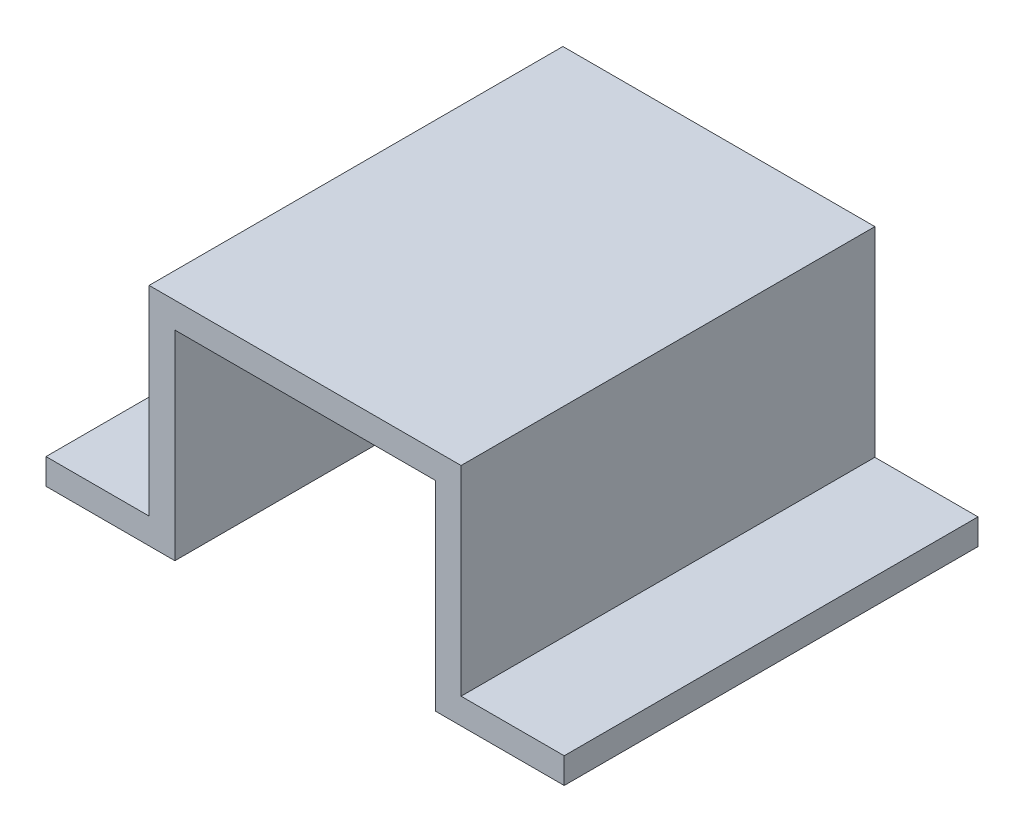
ISO-10303-21;
HEADER;
FILE_DESCRIPTION(('STEP AP214'),'2;1');
FILE_NAME('part.step','',(''),(''),'','','');
FILE_SCHEMA(('AUTOMOTIVE_DESIGN { 1 0 10303 214 1 1 1 1 }'));
ENDSEC;
DATA;
#1=APPLICATION_CONTEXT('core data for automotive mechanical design processes');
#2=APPLICATION_PROTOCOL_DEFINITION('international standard','automotive_design',2000,#1);
#3=PRODUCT_CONTEXT('',#1,'mechanical');
#4=PRODUCT('Part','Part','',(#3));
#5=PRODUCT_RELATED_PRODUCT_CATEGORY('part','',(#4));
#6=PRODUCT_DEFINITION_FORMATION('','',#4);
#7=PRODUCT_DEFINITION_CONTEXT('part definition',#1,'design');
#8=PRODUCT_DEFINITION('design','',#6,#7);
#9=PRODUCT_DEFINITION_SHAPE('','',#8);
#10=(LENGTH_UNIT() NAMED_UNIT(*) SI_UNIT(.MILLI.,.METRE.));
#11=(NAMED_UNIT(*) PLANE_ANGLE_UNIT() SI_UNIT($,.RADIAN.));
#12=(NAMED_UNIT(*) SI_UNIT($,.STERADIAN.) SOLID_ANGLE_UNIT());
#13=UNCERTAINTY_MEASURE_WITH_UNIT(LENGTH_MEASURE(1.E-05),#10,'distance_accuracy_value','');
#14=(GEOMETRIC_REPRESENTATION_CONTEXT(3) GLOBAL_UNCERTAINTY_ASSIGNED_CONTEXT((#13)) GLOBAL_UNIT_ASSIGNED_CONTEXT((#10,
#11,#12)) REPRESENTATION_CONTEXT('',''));
#15=CARTESIAN_POINT('',(0.,0.,0.));
#16=DIRECTION('',(0.,0.,1.));
#17=DIRECTION('',(1.,0.,0.));
#18=AXIS2_PLACEMENT_3D('',#15,#16,#17);
#19=CARTESIAN_POINT('',(26.1770114942529,-16.6609195402299,-32.1));
#20=DIRECTION('',(1.,0.,0.));
#21=DIRECTION('',(0.,0.,-1.));
#22=AXIS2_PLACEMENT_3D('',#19,#20,#21);
#23=PLANE('',#22);
#24=DIRECTION('',(0.,1.,0.));
#25=VECTOR('',#24,1.);
#26=CARTESIAN_POINT('',(26.1770114942529,-16.6609195402299,0.));
#27=LINE('',#26,#25);
#28=CARTESIAN_POINT('',(26.1770114942529,-18.6609195402299,0.));
#29=VERTEX_POINT('',#28);
#30=CARTESIAN_POINT('',(26.1770114942529,-16.6609195402299,0.));
#31=VERTEX_POINT('',#30);
#32=EDGE_CURVE('E158',#29,#31,#27,.T.);
#33=ORIENTED_EDGE('',*,*,#32,.F.);
#34=DIRECTION('',(0.,0.,1.));
#35=VECTOR('',#34,1.);
#36=CARTESIAN_POINT('',(26.1770114942529,-18.6609195402299,-32.1));
#37=LINE('',#36,#35);
#38=CARTESIAN_POINT('',(26.1770114942529,-18.6609195402299,-32.1));
#39=VERTEX_POINT('',#38);
#40=EDGE_CURVE('E11',#39,#29,#37,.T.);
#41=ORIENTED_EDGE('',*,*,#40,.F.);
#42=DIRECTION('',(0.,1.,0.));
#43=VECTOR('',#42,1.);
#44=CARTESIAN_POINT('',(26.1770114942529,-16.6609195402299,-32.1));
#45=LINE('',#44,#43);
#46=CARTESIAN_POINT('',(26.1770114942529,-16.6609195402299,-32.1));
#47=VERTEX_POINT('',#46);
#48=EDGE_CURVE('E190',#39,#47,#45,.T.);
#49=ORIENTED_EDGE('',*,*,#48,.T.);
#50=DIRECTION('',(0.,0.,1.));
#51=VECTOR('',#50,1.);
#52=CARTESIAN_POINT('',(26.1770114942529,-16.6609195402299,-32.1));
#53=LINE('',#52,#51);
#54=EDGE_CURVE('E40',#47,#31,#53,.T.);
#55=ORIENTED_EDGE('',*,*,#54,.T.);
#56=EDGE_LOOP('',(#33,#41,#49,#55));
#57=FACE_BOUND('',#56,.T.);
#58=ADVANCED_FACE('F37',(#57),#23,.T.);
#59=CARTESIAN_POINT('',(26.1770114942529,-18.6609195402299,-32.1));
#60=DIRECTION('',(0.,-1.,0.));
#61=DIRECTION('',(0.,0.,-1.));
#62=AXIS2_PLACEMENT_3D('',#59,#60,#61);
#63=PLANE('',#62);
#64=DIRECTION('',(1.,0.,0.));
#65=VECTOR('',#64,1.);
#66=CARTESIAN_POINT('',(26.1770114942529,-18.6609195402299,0.));
#67=LINE('',#66,#65);
#68=CARTESIAN_POINT('',(16.1770114942529,-18.6609195402299,0.));
#69=VERTEX_POINT('',#68);
#70=EDGE_CURVE('E188',#69,#29,#67,.T.);
#71=ORIENTED_EDGE('',*,*,#70,.F.);
#72=DIRECTION('',(0.,0.,1.));
#73=VECTOR('',#72,1.);
#74=CARTESIAN_POINT('',(16.1770114942529,-18.6609195402299,-32.1));
#75=LINE('',#74,#73);
#76=CARTESIAN_POINT('',(16.1770114942529,-18.6609195402299,-32.1));
#77=VERTEX_POINT('',#76);
#78=EDGE_CURVE('E46',#77,#69,#75,.T.);
#79=ORIENTED_EDGE('',*,*,#78,.F.);
#80=DIRECTION('',(1.,0.,0.));
#81=VECTOR('',#80,1.);
#82=CARTESIAN_POINT('',(26.1770114942529,-18.6609195402299,-32.1));
#83=LINE('',#82,#81);
#84=EDGE_CURVE('E148',#77,#39,#83,.T.);
#85=ORIENTED_EDGE('',*,*,#84,.T.);
#86=ORIENTED_EDGE('',*,*,#40,.T.);
#87=EDGE_LOOP('',(#71,#79,#85,#86));
#88=FACE_BOUND('',#87,.T.);
#89=ADVANCED_FACE('F210',(#88),#63,.T.);
#90=CARTESIAN_POINT('',(16.1770114942529,-18.6609195402299,-32.1));
#91=DIRECTION('',(-1.,0.,0.));
#92=DIRECTION('',(0.,0.,1.));
#93=AXIS2_PLACEMENT_3D('',#90,#91,#92);
#94=PLANE('',#93);
#95=DIRECTION('',(0.,-1.,0.));
#96=VECTOR('',#95,1.);
#97=CARTESIAN_POINT('',(16.1770114942529,-18.6609195402299,0.));
#98=LINE('',#97,#96);
#99=CARTESIAN_POINT('',(16.1770114942529,-3.16091954022988,0.));
#100=VERTEX_POINT('',#99);
#101=EDGE_CURVE('E135',#100,#69,#98,.T.);
#102=ORIENTED_EDGE('',*,*,#101,.F.);
#103=DIRECTION('',(0.,0.,1.));
#104=VECTOR('',#103,1.);
#105=CARTESIAN_POINT('',(16.1770114942529,-3.16091954022988,-32.1));
#106=LINE('',#105,#104);
#107=CARTESIAN_POINT('',(16.1770114942529,-3.16091954022988,-32.1));
#108=VERTEX_POINT('',#107);
#109=EDGE_CURVE('E130',#108,#100,#106,.T.);
#110=ORIENTED_EDGE('',*,*,#109,.F.);
#111=DIRECTION('',(0.,-1.,0.));
#112=VECTOR('',#111,1.);
#113=CARTESIAN_POINT('',(16.1770114942529,-18.6609195402299,-32.1));
#114=LINE('',#113,#112);
#115=EDGE_CURVE('E133',#108,#77,#114,.T.);
#116=ORIENTED_EDGE('',*,*,#115,.T.);
#117=ORIENTED_EDGE('',*,*,#78,.T.);
#118=EDGE_LOOP('',(#102,#110,#116,#117));
#119=FACE_BOUND('',#118,.T.);
#120=ADVANCED_FACE('F132',(#119),#94,.T.);
#121=CARTESIAN_POINT('',(16.1770114942529,-3.16091954022988,-32.1));
#122=DIRECTION('',(0.,-1.,0.));
#123=DIRECTION('',(1.,0.,0.));
#124=AXIS2_PLACEMENT_3D('',#121,#122,#123);
#125=PLANE('',#124);
#126=DIRECTION('',(1.,0.,0.));
#127=VECTOR('',#126,1.);
#128=CARTESIAN_POINT('',(16.1770114942529,-3.16091954022988,0.));
#129=LINE('',#128,#127);
#130=CARTESIAN_POINT('',(-4.02298850574712,-3.16091954022988,0.));
#131=VERTEX_POINT('',#130);
#132=EDGE_CURVE('E185',#131,#100,#129,.T.);
#133=ORIENTED_EDGE('',*,*,#132,.F.);
#134=DIRECTION('',(0.,0.,1.));
#135=VECTOR('',#134,1.);
#136=CARTESIAN_POINT('',(-4.02298850574712,-3.16091954022988,-32.1));
#137=LINE('',#136,#135);
#138=CARTESIAN_POINT('',(-4.02298850574712,-3.16091954022988,-32.1));
#139=VERTEX_POINT('',#138);
#140=EDGE_CURVE('E140',#139,#131,#137,.T.);
#141=ORIENTED_EDGE('',*,*,#140,.F.);
#142=DIRECTION('',(1.,0.,0.));
#143=VECTOR('',#142,1.);
#144=CARTESIAN_POINT('',(16.1770114942529,-3.16091954022988,-32.1));
#145=LINE('',#144,#143);
#146=EDGE_CURVE('E146',#139,#108,#145,.T.);
#147=ORIENTED_EDGE('',*,*,#146,.T.);
#148=ORIENTED_EDGE('',*,*,#109,.T.);
#149=EDGE_LOOP('',(#133,#141,#147,#148));
#150=FACE_BOUND('',#149,.T.);
#151=ADVANCED_FACE('F150',(#150),#125,.T.);
#152=CARTESIAN_POINT('',(-4.02298850574712,-3.16091954022988,-32.1));
#153=DIRECTION('',(1.,0.,0.));
#154=DIRECTION('',(0.,1.,0.));
#155=AXIS2_PLACEMENT_3D('',#152,#153,#154);
#156=PLANE('',#155);
#157=DIRECTION('',(0.,1.,0.));
#158=VECTOR('',#157,1.);
#159=CARTESIAN_POINT('',(-4.02298850574712,-3.16091954022988,0.));
#160=LINE('',#159,#158);
#161=CARTESIAN_POINT('',(-4.02298850574712,-18.6609195402299,0.));
#162=VERTEX_POINT('',#161);
#163=EDGE_CURVE('E182',#162,#131,#160,.T.);
#164=ORIENTED_EDGE('',*,*,#163,.F.);
#165=DIRECTION('',(0.,0.,1.));
#166=VECTOR('',#165,1.);
#167=CARTESIAN_POINT('',(-4.02298850574712,-18.6609195402299,-32.1));
#168=LINE('',#167,#166);
#169=CARTESIAN_POINT('',(-4.02298850574712,-18.6609195402299,-32.1));
#170=VERTEX_POINT('',#169);
#171=EDGE_CURVE('E194',#170,#162,#168,.T.);
#172=ORIENTED_EDGE('',*,*,#171,.F.);
#173=DIRECTION('',(0.,1.,0.));
#174=VECTOR('',#173,1.);
#175=CARTESIAN_POINT('',(-4.02298850574712,-3.16091954022988,-32.1));
#176=LINE('',#175,#174);
#177=EDGE_CURVE('E151',#170,#139,#176,.T.);
#178=ORIENTED_EDGE('',*,*,#177,.T.);
#179=ORIENTED_EDGE('',*,*,#140,.T.);
#180=EDGE_LOOP('',(#164,#172,#178,#179));
#181=FACE_BOUND('',#180,.T.);
#182=ADVANCED_FACE('F223',(#181),#156,.T.);
#183=CARTESIAN_POINT('',(-4.02298850574712,-18.6609195402299,-32.1));
#184=DIRECTION('',(0.,-1.,0.));
#185=DIRECTION('',(1.,0.,0.));
#186=AXIS2_PLACEMENT_3D('',#183,#184,#185);
#187=PLANE('',#186);
#188=DIRECTION('',(1.,0.,0.));
#189=VECTOR('',#188,1.);
#190=CARTESIAN_POINT('',(-4.02298850574712,-18.6609195402299,0.));
#191=LINE('',#190,#189);
#192=CARTESIAN_POINT('',(-14.0229885057471,-18.6609195402299,0.));
#193=VERTEX_POINT('',#192);
#194=EDGE_CURVE('E179',#193,#162,#191,.T.);
#195=ORIENTED_EDGE('',*,*,#194,.F.);
#196=DIRECTION('',(0.,0.,1.));
#197=VECTOR('',#196,1.);
#198=CARTESIAN_POINT('',(-14.0229885057471,-18.6609195402299,-32.1));
#199=LINE('',#198,#197);
#200=CARTESIAN_POINT('',(-14.0229885057471,-18.6609195402299,-32.1));
#201=VERTEX_POINT('',#200);
#202=EDGE_CURVE('E196',#201,#193,#199,.T.);
#203=ORIENTED_EDGE('',*,*,#202,.F.);
#204=DIRECTION('',(1.,0.,0.));
#205=VECTOR('',#204,1.);
#206=CARTESIAN_POINT('',(-4.02298850574712,-18.6609195402299,-32.1));
#207=LINE('',#206,#205);
#208=EDGE_CURVE('E153',#201,#170,#207,.T.);
#209=ORIENTED_EDGE('',*,*,#208,.T.);
#210=ORIENTED_EDGE('',*,*,#171,.T.);
#211=EDGE_LOOP('',(#195,#203,#209,#210));
#212=FACE_BOUND('',#211,.T.);
#213=ADVANCED_FACE('F226',(#212),#187,.T.);
#214=CARTESIAN_POINT('',(-14.0229885057471,-18.6609195402299,-32.1));
#215=DIRECTION('',(-1.,0.,0.));
#216=DIRECTION('',(0.,0.,1.));
#217=AXIS2_PLACEMENT_3D('',#214,#215,#216);
#218=PLANE('',#217);
#219=DIRECTION('',(0.,-1.,0.));
#220=VECTOR('',#219,1.);
#221=CARTESIAN_POINT('',(-14.0229885057471,-18.6609195402299,0.));
#222=LINE('',#221,#220);
#223=CARTESIAN_POINT('',(-14.0229885057471,-16.6609195402299,0.));
#224=VERTEX_POINT('',#223);
#225=EDGE_CURVE('E176',#224,#193,#222,.T.);
#226=ORIENTED_EDGE('',*,*,#225,.F.);
#227=DIRECTION('',(0.,0.,1.));
#228=VECTOR('',#227,1.);
#229=CARTESIAN_POINT('',(-14.0229885057471,-16.6609195402299,-32.1));
#230=LINE('',#229,#228);
#231=CARTESIAN_POINT('',(-14.0229885057471,-16.6609195402299,-32.1));
#232=VERTEX_POINT('',#231);
#233=EDGE_CURVE('E198',#232,#224,#230,.T.);
#234=ORIENTED_EDGE('',*,*,#233,.F.);
#235=DIRECTION('',(0.,-1.,0.));
#236=VECTOR('',#235,1.);
#237=CARTESIAN_POINT('',(-14.0229885057471,-18.6609195402299,-32.1));
#238=LINE('',#237,#236);
#239=EDGE_CURVE('E352',#232,#201,#238,.T.);
#240=ORIENTED_EDGE('',*,*,#239,.T.);
#241=ORIENTED_EDGE('',*,*,#202,.T.);
#242=EDGE_LOOP('',(#226,#234,#240,#241));
#243=FACE_BOUND('',#242,.T.);
#244=ADVANCED_FACE('F230',(#243),#218,.T.);
#245=CARTESIAN_POINT('',(-14.0229885057471,-16.6609195402299,-32.1));
#246=DIRECTION('',(0.,1.,0.));
#247=DIRECTION('',(-1.,0.,0.));
#248=AXIS2_PLACEMENT_3D('',#245,#246,#247);
#249=PLANE('',#248);
#250=DIRECTION('',(-1.,0.,0.));
#251=VECTOR('',#250,1.);
#252=CARTESIAN_POINT('',(-14.0229885057471,-16.6609195402299,0.));
#253=LINE('',#252,#251);
#254=CARTESIAN_POINT('',(-6.02298850574712,-16.6609195402299,0.));
#255=VERTEX_POINT('',#254);
#256=EDGE_CURVE('E173',#255,#224,#253,.T.);
#257=ORIENTED_EDGE('',*,*,#256,.F.);
#258=DIRECTION('',(0.,0.,1.));
#259=VECTOR('',#258,1.);
#260=CARTESIAN_POINT('',(-6.02298850574712,-16.6609195402299,-32.1));
#261=LINE('',#260,#259);
#262=CARTESIAN_POINT('',(-6.02298850574712,-16.6609195402299,-32.1));
#263=VERTEX_POINT('',#262);
#264=EDGE_CURVE('E200',#263,#255,#261,.T.);
#265=ORIENTED_EDGE('',*,*,#264,.F.);
#266=DIRECTION('',(-1.,0.,0.));
#267=VECTOR('',#266,1.);
#268=CARTESIAN_POINT('',(-14.0229885057471,-16.6609195402299,-32.1));
#269=LINE('',#268,#267);
#270=EDGE_CURVE('E356',#263,#232,#269,.T.);
#271=ORIENTED_EDGE('',*,*,#270,.T.);
#272=ORIENTED_EDGE('',*,*,#233,.T.);
#273=EDGE_LOOP('',(#257,#265,#271,#272));
#274=FACE_BOUND('',#273,.T.);
#275=ADVANCED_FACE('F234',(#274),#249,.T.);
#276=CARTESIAN_POINT('',(-6.02298850574712,-16.6609195402299,-32.1));
#277=DIRECTION('',(-1.,0.,0.));
#278=DIRECTION('',(0.,0.,1.));
#279=AXIS2_PLACEMENT_3D('',#276,#277,#278);
#280=PLANE('',#279);
#281=DIRECTION('',(0.,-1.,0.));
#282=VECTOR('',#281,1.);
#283=CARTESIAN_POINT('',(-6.02298850574712,-16.6609195402299,0.));
#284=LINE('',#283,#282);
#285=CARTESIAN_POINT('',(-6.02298850574712,-1.16091954022989,0.));
#286=VERTEX_POINT('',#285);
#287=EDGE_CURVE('E170',#286,#255,#284,.T.);
#288=ORIENTED_EDGE('',*,*,#287,.F.);
#289=DIRECTION('',(0.,0.,1.));
#290=VECTOR('',#289,1.);
#291=CARTESIAN_POINT('',(-6.02298850574712,-1.16091954022989,-32.1));
#292=LINE('',#291,#290);
#293=CARTESIAN_POINT('',(-6.02298850574712,-1.16091954022989,-32.1));
#294=VERTEX_POINT('',#293);
#295=EDGE_CURVE('E202',#294,#286,#292,.T.);
#296=ORIENTED_EDGE('',*,*,#295,.F.);
#297=DIRECTION('',(0.,-1.,0.));
#298=VECTOR('',#297,1.);
#299=CARTESIAN_POINT('',(-6.02298850574712,-16.6609195402299,-32.1));
#300=LINE('',#299,#298);
#301=EDGE_CURVE('E345',#294,#263,#300,.T.);
#302=ORIENTED_EDGE('',*,*,#301,.T.);
#303=ORIENTED_EDGE('',*,*,#264,.T.);
#304=EDGE_LOOP('',(#288,#296,#302,#303));
#305=FACE_BOUND('',#304,.T.);
#306=ADVANCED_FACE('F238',(#305),#280,.T.);
#307=CARTESIAN_POINT('',(-6.02298850574712,-1.16091954022989,-32.1));
#308=DIRECTION('',(0.,1.,0.));
#309=DIRECTION('',(-1.,0.,0.));
#310=AXIS2_PLACEMENT_3D('',#307,#308,#309);
#311=PLANE('',#310);
#312=DIRECTION('',(-1.,0.,0.));
#313=VECTOR('',#312,1.);
#314=CARTESIAN_POINT('',(-6.02298850574712,-1.16091954022989,0.));
#315=LINE('',#314,#313);
#316=CARTESIAN_POINT('',(18.1770114942529,-1.16091954022988,0.));
#317=VERTEX_POINT('',#316);
#318=EDGE_CURVE('E167',#317,#286,#315,.T.);
#319=ORIENTED_EDGE('',*,*,#318,.F.);
#320=DIRECTION('',(0.,0.,1.));
#321=VECTOR('',#320,1.);
#322=CARTESIAN_POINT('',(18.1770114942529,-1.16091954022988,-32.1));
#323=LINE('',#322,#321);
#324=CARTESIAN_POINT('',(18.1770114942529,-1.16091954022988,-32.1));
#325=VERTEX_POINT('',#324);
#326=EDGE_CURVE('E204',#325,#317,#323,.T.);
#327=ORIENTED_EDGE('',*,*,#326,.F.);
#328=DIRECTION('',(-1.,0.,0.));
#329=VECTOR('',#328,1.);
#330=CARTESIAN_POINT('',(-6.02298850574712,-1.16091954022989,-32.1));
#331=LINE('',#330,#329);
#332=EDGE_CURVE('E341',#325,#294,#331,.T.);
#333=ORIENTED_EDGE('',*,*,#332,.T.);
#334=ORIENTED_EDGE('',*,*,#295,.T.);
#335=EDGE_LOOP('',(#319,#327,#333,#334));
#336=FACE_BOUND('',#335,.T.);
#337=ADVANCED_FACE('F242',(#336),#311,.T.);
#338=CARTESIAN_POINT('',(18.1770114942529,-1.16091954022988,-32.1));
#339=DIRECTION('',(1.,0.,0.));
#340=DIRECTION('',(0.,1.,0.));
#341=AXIS2_PLACEMENT_3D('',#338,#339,#340);
#342=PLANE('',#341);
#343=DIRECTION('',(0.,1.,0.));
#344=VECTOR('',#343,1.);
#345=CARTESIAN_POINT('',(18.1770114942529,-1.16091954022988,0.));
#346=LINE('',#345,#344);
#347=CARTESIAN_POINT('',(18.1770114942529,-16.6609195402299,0.));
#348=VERTEX_POINT('',#347);
#349=EDGE_CURVE('E164',#348,#317,#346,.T.);
#350=ORIENTED_EDGE('',*,*,#349,.F.);
#351=DIRECTION('',(0.,0.,1.));
#352=VECTOR('',#351,1.);
#353=CARTESIAN_POINT('',(18.1770114942529,-16.6609195402299,-32.1));
#354=LINE('',#353,#352);
#355=CARTESIAN_POINT('',(18.1770114942529,-16.6609195402299,-32.1));
#356=VERTEX_POINT('',#355);
#357=EDGE_CURVE('E205',#356,#348,#354,.T.);
#358=ORIENTED_EDGE('',*,*,#357,.F.);
#359=DIRECTION('',(0.,1.,0.));
#360=VECTOR('',#359,1.);
#361=CARTESIAN_POINT('',(18.1770114942529,-1.16091954022988,-32.1));
#362=LINE('',#361,#360);
#363=EDGE_CURVE('E362',#356,#325,#362,.T.);
#364=ORIENTED_EDGE('',*,*,#363,.T.);
#365=ORIENTED_EDGE('',*,*,#326,.T.);
#366=EDGE_LOOP('',(#350,#358,#364,#365));
#367=FACE_BOUND('',#366,.T.);
#368=ADVANCED_FACE('F246',(#367),#342,.T.);
#369=CARTESIAN_POINT('',(18.1770114942529,-16.6609195402299,-32.1));
#370=DIRECTION('',(0.,1.,0.));
#371=DIRECTION('',(0.,0.,1.));
#372=AXIS2_PLACEMENT_3D('',#369,#370,#371);
#373=PLANE('',#372);
#374=DIRECTION('',(-1.,0.,0.));
#375=VECTOR('',#374,1.);
#376=CARTESIAN_POINT('',(18.1770114942529,-16.6609195402299,0.));
#377=LINE('',#376,#375);
#378=EDGE_CURVE('E161',#31,#348,#377,.T.);
#379=ORIENTED_EDGE('',*,*,#378,.F.);
#380=ORIENTED_EDGE('',*,*,#54,.F.);
#381=DIRECTION('',(-1.,0.,0.));
#382=VECTOR('',#381,1.);
#383=CARTESIAN_POINT('',(18.1770114942529,-16.6609195402299,-32.1));
#384=LINE('',#383,#382);
#385=EDGE_CURVE('E364',#47,#356,#384,.T.);
#386=ORIENTED_EDGE('',*,*,#385,.T.);
#387=ORIENTED_EDGE('',*,*,#357,.T.);
#388=EDGE_LOOP('',(#379,#380,#386,#387));
#389=FACE_BOUND('',#388,.T.);
#390=ADVANCED_FACE('F207',(#389),#373,.T.);
#391=CARTESIAN_POINT('',(0.,0.,-32.1));
#392=DIRECTION('',(0.,0.,-1.));
#393=DIRECTION('',(-1.,0.,0.));
#394=AXIS2_PLACEMENT_3D('',#391,#392,#393);
#395=PLANE('',#394);
#396=ORIENTED_EDGE('',*,*,#48,.F.);
#397=ORIENTED_EDGE('',*,*,#84,.F.);
#398=ORIENTED_EDGE('',*,*,#115,.F.);
#399=ORIENTED_EDGE('',*,*,#146,.F.);
#400=ORIENTED_EDGE('',*,*,#177,.F.);
#401=ORIENTED_EDGE('',*,*,#208,.F.);
#402=ORIENTED_EDGE('',*,*,#239,.F.);
#403=ORIENTED_EDGE('',*,*,#270,.F.);
#404=ORIENTED_EDGE('',*,*,#301,.F.);
#405=ORIENTED_EDGE('',*,*,#332,.F.);
#406=ORIENTED_EDGE('',*,*,#363,.F.);
#407=ORIENTED_EDGE('',*,*,#385,.F.);
#408=EDGE_LOOP('',(#396,#397,#398,#399,#400,#401,#402,#403,#404,#405,#406,#407));
#409=FACE_BOUND('',#408,.T.);
#410=ADVANCED_FACE('F144',(#409),#395,.T.);
#411=CARTESIAN_POINT('',(0.,0.,0.));
#412=DIRECTION('',(0.,0.,-1.));
#413=DIRECTION('',(-1.,0.,0.));
#414=AXIS2_PLACEMENT_3D('',#411,#412,#413);
#415=PLANE('',#414);
#416=ORIENTED_EDGE('',*,*,#32,.T.);
#417=ORIENTED_EDGE('',*,*,#378,.T.);
#418=ORIENTED_EDGE('',*,*,#349,.T.);
#419=ORIENTED_EDGE('',*,*,#318,.T.);
#420=ORIENTED_EDGE('',*,*,#287,.T.);
#421=ORIENTED_EDGE('',*,*,#256,.T.);
#422=ORIENTED_EDGE('',*,*,#225,.T.);
#423=ORIENTED_EDGE('',*,*,#194,.T.);
#424=ORIENTED_EDGE('',*,*,#163,.T.);
#425=ORIENTED_EDGE('',*,*,#132,.T.);
#426=ORIENTED_EDGE('',*,*,#101,.T.);
#427=ORIENTED_EDGE('',*,*,#70,.T.);
#428=EDGE_LOOP('',(#416,#417,#418,#419,#420,#421,#422,#423,#424,#425,#426,#427));
#429=FACE_BOUND('',#428,.T.);
#430=ADVANCED_FACE('F209',(#429),#415,.F.);
#431=CLOSED_SHELL('',(#58,#89,#120,#151,#182,#213,#244,#275,#306,#337,#368,#390,#410,#430));
#432=MANIFOLD_SOLID_BREP('B2',#431);
#433=ADVANCED_BREP_SHAPE_REPRESENTATION('',(#18,#432),#14);
#434=SHAPE_DEFINITION_REPRESENTATION(#9,#433);
ENDSEC;
END-ISO-10303-21;
